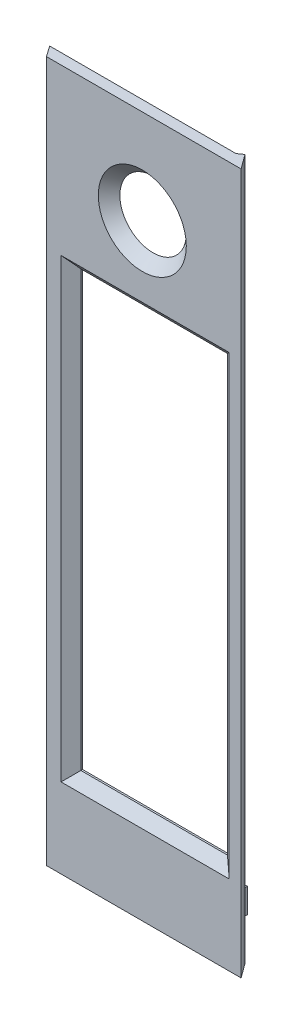
ISO-10303-21;
HEADER;
FILE_DESCRIPTION(('STEP AP214'),'2;1');
FILE_NAME('part.step','',(''),(''),'','','');
FILE_SCHEMA(('AUTOMOTIVE_DESIGN { 1 0 10303 214 1 1 1 1 }'));
ENDSEC;
DATA;
#1=APPLICATION_CONTEXT('core data for automotive mechanical design processes');
#2=APPLICATION_PROTOCOL_DEFINITION('international standard','automotive_design',2000,#1);
#3=PRODUCT_CONTEXT('',#1,'mechanical');
#4=PRODUCT('Part','Part','',(#3));
#5=PRODUCT_RELATED_PRODUCT_CATEGORY('part','',(#4));
#6=PRODUCT_DEFINITION_FORMATION('','',#4);
#7=PRODUCT_DEFINITION_CONTEXT('part definition',#1,'design');
#8=PRODUCT_DEFINITION('design','',#6,#7);
#9=PRODUCT_DEFINITION_SHAPE('','',#8);
#10=(LENGTH_UNIT() NAMED_UNIT(*) SI_UNIT(.MILLI.,.METRE.));
#11=(NAMED_UNIT(*) PLANE_ANGLE_UNIT() SI_UNIT($,.RADIAN.));
#12=(NAMED_UNIT(*) SI_UNIT($,.STERADIAN.) SOLID_ANGLE_UNIT());
#13=UNCERTAINTY_MEASURE_WITH_UNIT(LENGTH_MEASURE(1.E-05),#10,'distance_accuracy_value','');
#14=(GEOMETRIC_REPRESENTATION_CONTEXT(3) GLOBAL_UNCERTAINTY_ASSIGNED_CONTEXT((#13)) GLOBAL_UNIT_ASSIGNED_CONTEXT((#10,
#11,#12)) REPRESENTATION_CONTEXT('',''));
#15=CARTESIAN_POINT('',(0.,0.,0.));
#16=DIRECTION('',(0.,0.,1.));
#17=DIRECTION('',(1.,0.,0.));
#18=AXIS2_PLACEMENT_3D('',#15,#16,#17);
#19=CARTESIAN_POINT('',(0.,0.,0.));
#20=DIRECTION('',(0.,0.,1.));
#21=DIRECTION('',(1.,0.,0.));
#22=AXIS2_PLACEMENT_3D('',#19,#20,#21);
#23=PLANE('',#22);
#24=DIRECTION('',(0.,1.,0.));
#25=VECTOR('',#24,1.);
#26=CARTESIAN_POINT('',(-28.8258205594295,28.31847753789,0.));
#27=LINE('',#26,#25);
#28=CARTESIAN_POINT('',(-28.8258205594295,28.31847753789,0.));
#29=VERTEX_POINT('',#28);
#30=CARTESIAN_POINT('',(-28.8258205594295,29.06,0.));
#31=VERTEX_POINT('',#30);
#32=EDGE_CURVE('E348',#29,#31,#27,.T.);
#33=ORIENTED_EDGE('',*,*,#32,.F.);
#34=DIRECTION('',(-0.707106781186547,0.707106781186548,0.));
#35=VECTOR('',#34,1.);
#36=CARTESIAN_POINT('',(-25.4772649871259,24.9699219655863,0.));
#37=LINE('',#36,#35);
#38=CARTESIAN_POINT('',(-25.4772649871259,24.9699219655863,0.));
#39=VERTEX_POINT('',#38);
#40=EDGE_CURVE('E332',#39,#29,#37,.T.);
#41=ORIENTED_EDGE('',*,*,#40,.F.);
#42=DIRECTION('',(-1.,0.,0.));
#43=VECTOR('',#42,1.);
#44=CARTESIAN_POINT('',(-24.3676581572758,24.9699219655863,0.));
#45=LINE('',#44,#43);
#46=CARTESIAN_POINT('',(-24.3676581572758,24.9699219655863,0.));
#47=VERTEX_POINT('',#46);
#48=EDGE_CURVE('E335',#47,#39,#45,.T.);
#49=ORIENTED_EDGE('',*,*,#48,.F.);
#50=DIRECTION('',(0.,-1.,0.));
#51=VECTOR('',#50,1.);
#52=CARTESIAN_POINT('',(-24.3676581572758,27.0360334536606,0.));
#53=LINE('',#52,#51);
#54=CARTESIAN_POINT('',(-24.3676581572758,27.0360334536606,0.));
#55=VERTEX_POINT('',#54);
#56=EDGE_CURVE('E339',#55,#47,#53,.T.);
#57=ORIENTED_EDGE('',*,*,#56,.F.);
#58=DIRECTION('',(0.707106781186547,-0.707106781186548,0.));
#59=VECTOR('',#58,1.);
#60=CARTESIAN_POINT('',(-26.3916247036152,29.06,0.));
#61=LINE('',#60,#59);
#62=CARTESIAN_POINT('',(-26.3916247036152,29.06,0.));
#63=VERTEX_POINT('',#62);
#64=EDGE_CURVE('E342',#63,#55,#61,.T.);
#65=ORIENTED_EDGE('',*,*,#64,.F.);
#66=DIRECTION('',(1.,0.,0.));
#67=VECTOR('',#66,1.);
#68=CARTESIAN_POINT('',(-28.8258205594295,29.06,0.));
#69=LINE('',#68,#67);
#70=EDGE_CURVE('E345',#31,#63,#69,.T.);
#71=ORIENTED_EDGE('',*,*,#70,.F.);
#72=EDGE_LOOP('',(#33,#41,#49,#57,#65,#71));
#73=FACE_BOUND('',#72,.T.);
#74=DIRECTION('',(0.,-1.,0.));
#75=VECTOR('',#74,1.);
#76=CARTESIAN_POINT('',(-36.7042825394933,16.2,0.));
#77=LINE('',#76,#75);
#78=CARTESIAN_POINT('',(-36.7042825394933,16.2,0.));
#79=VERTEX_POINT('',#78);
#80=CARTESIAN_POINT('',(-36.7042825394933,-24.1,0.));
#81=VERTEX_POINT('',#80);
#82=EDGE_CURVE('E411',#79,#81,#77,.T.);
#83=ORIENTED_EDGE('',*,*,#82,.T.);
#84=DIRECTION('',(1.,0.,0.));
#85=VECTOR('',#84,1.);
#86=CARTESIAN_POINT('',(-36.7042825394933,-24.1,0.));
#87=LINE('',#86,#85);
#88=CARTESIAN_POINT('',(-23.1042825394933,-24.1,0.));
#89=VERTEX_POINT('',#88);
#90=EDGE_CURVE('E414',#81,#89,#87,.T.);
#91=ORIENTED_EDGE('',*,*,#90,.T.);
#92=DIRECTION('',(0.,1.,0.));
#93=VECTOR('',#92,1.);
#94=CARTESIAN_POINT('',(-23.1042825394933,16.2,0.));
#95=LINE('',#94,#93);
#96=CARTESIAN_POINT('',(-23.1042825394933,16.2,0.));
#97=VERTEX_POINT('',#96);
#98=EDGE_CURVE('E417',#89,#97,#95,.T.);
#99=ORIENTED_EDGE('',*,*,#98,.T.);
#100=DIRECTION('',(-1.,0.,0.));
#101=VECTOR('',#100,1.);
#102=CARTESIAN_POINT('',(-36.7042825394933,16.2,0.));
#103=LINE('',#102,#101);
#104=EDGE_CURVE('E420',#97,#79,#103,.T.);
#105=ORIENTED_EDGE('',*,*,#104,.T.);
#106=EDGE_LOOP('',(#83,#91,#99,#105));
#107=FACE_BOUND('',#106,.T.);
#108=DIRECTION('',(-1.,0.,0.));
#109=VECTOR('',#108,1.);
#110=CARTESIAN_POINT('',(-39.7589822132106,32.5,0.));
#111=LINE('',#110,#109);
#112=CARTESIAN_POINT('',(-22.4809540872309,32.5,0.));
#113=VERTEX_POINT('',#112);
#114=CARTESIAN_POINT('',(-39.7589822132106,32.5,0.));
#115=VERTEX_POINT('',#114);
#116=EDGE_CURVE('E438',#113,#115,#111,.T.);
#117=ORIENTED_EDGE('',*,*,#116,.F.);
#118=DIRECTION('',(0.,-1.,0.));
#119=VECTOR('',#118,1.);
#120=CARTESIAN_POINT('',(-22.4809540872309,33.3196787347788,0.));
#121=LINE('',#120,#119);
#122=CARTESIAN_POINT('',(-22.4809540872309,-32.5,0.));
#123=VERTEX_POINT('',#122);
#124=EDGE_CURVE('E242',#113,#123,#121,.T.);
#125=ORIENTED_EDGE('',*,*,#124,.T.);
#126=DIRECTION('',(1.,0.,0.));
#127=VECTOR('',#126,1.);
#128=CARTESIAN_POINT('',(-39.7589822132106,-32.5,0.));
#129=LINE('',#128,#127);
#130=CARTESIAN_POINT('',(-39.7589822132106,-32.5,0.));
#131=VERTEX_POINT('',#130);
#132=EDGE_CURVE('E253',#131,#123,#129,.T.);
#133=ORIENTED_EDGE('',*,*,#132,.F.);
#134=DIRECTION('',(0.,-1.,0.));
#135=VECTOR('',#134,1.);
#136=CARTESIAN_POINT('',(-39.7589822132106,32.5,0.));
#137=LINE('',#136,#135);
#138=EDGE_CURVE('E434',#115,#131,#137,.T.);
#139=ORIENTED_EDGE('',*,*,#138,.F.);
#140=EDGE_LOOP('',(#117,#125,#133,#139));
#141=FACE_BOUND('',#140,.T.);
#142=CARTESIAN_POINT('',(-30.1676581572758,23.76,0.));
#143=DIRECTION('',(0.,0.,1.));
#144=DIRECTION('',(1.,0.,0.));
#145=AXIS2_PLACEMENT_3D('',#142,#143,#144);
#146=CIRCLE('',#145,3.08202397854911);
#147=CARTESIAN_POINT('',(-27.0856341787267,23.76,0.));
#148=VERTEX_POINT('',#147);
#149=EDGE_CURVE('E431',#148,#148,#146,.T.);
#150=ORIENTED_EDGE('',*,*,#149,.T.);
#151=EDGE_LOOP('',(#150));
#152=FACE_BOUND('',#151,.T.);
#153=DIRECTION('',(-1.,0.,0.));
#154=VECTOR('',#153,1.);
#155=CARTESIAN_POINT('',(-35.2676581572757,24.6975935006714,0.));
#156=LINE('',#155,#154);
#157=CARTESIAN_POINT('',(-35.2676581572757,24.6975935006714,0.));
#158=VERTEX_POINT('',#157);
#159=CARTESIAN_POINT('',(-36.2676581572757,24.6975935006714,0.));
#160=VERTEX_POINT('',#159);
#161=EDGE_CURVE('E351',#158,#160,#156,.T.);
#162=ORIENTED_EDGE('',*,*,#161,.F.);
#163=DIRECTION('',(-0.732988751760297,-0.680240758697156,0.));
#164=VECTOR('',#163,1.);
#165=CARTESIAN_POINT('',(-31.365999462503,28.31847753789,0.));
#166=LINE('',#165,#164);
#167=CARTESIAN_POINT('',(-31.365999462503,28.31847753789,0.));
#168=VERTEX_POINT('',#167);
#169=EDGE_CURVE('E367',#168,#158,#166,.T.);
#170=ORIENTED_EDGE('',*,*,#169,.F.);
#171=DIRECTION('',(0.,-1.,0.));
#172=VECTOR('',#171,1.);
#173=CARTESIAN_POINT('',(-31.365999462503,29.06,0.));
#174=LINE('',#173,#172);
#175=CARTESIAN_POINT('',(-31.365999462503,29.06,0.));
#176=VERTEX_POINT('',#175);
#177=EDGE_CURVE('E389',#176,#168,#174,.T.);
#178=ORIENTED_EDGE('',*,*,#177,.F.);
#179=DIRECTION('',(1.,0.,0.));
#180=VECTOR('',#179,1.);
#181=CARTESIAN_POINT('',(-34.9292866780418,29.06,0.));
#182=LINE('',#181,#180);
#183=CARTESIAN_POINT('',(-34.9292866780418,29.06,0.));
#184=VERTEX_POINT('',#183);
#185=EDGE_CURVE('E386',#184,#176,#182,.T.);
#186=ORIENTED_EDGE('',*,*,#185,.F.);
#187=DIRECTION('',(0.707106781186548,0.707106781186547,0.));
#188=VECTOR('',#187,1.);
#189=CARTESIAN_POINT('',(-36.2676581572757,27.721628520766,0.));
#190=LINE('',#189,#188);
#191=CARTESIAN_POINT('',(-36.2676581572757,27.721628520766,0.));
#192=VERTEX_POINT('',#191);
#193=EDGE_CURVE('E383',#192,#184,#190,.T.);
#194=ORIENTED_EDGE('',*,*,#193,.F.);
#195=DIRECTION('',(0.,1.,0.));
#196=VECTOR('',#195,1.);
#197=CARTESIAN_POINT('',(-36.2676581572757,24.6975935006714,0.));
#198=LINE('',#197,#196);
#199=EDGE_CURVE('E380',#160,#192,#198,.T.);
#200=ORIENTED_EDGE('',*,*,#199,.F.);
#201=EDGE_LOOP('',(#162,#170,#178,#186,#194,#200));
#202=FACE_BOUND('',#201,.T.);
#203=DIRECTION('',(0.,1.,0.));
#204=VECTOR('',#203,1.);
#205=CARTESIAN_POINT('',(-34.5712530855965,-29.9150808401263,0.));
#206=LINE('',#205,#204);
#207=CARTESIAN_POINT('',(-34.5712530855965,-29.9150808401263,0.));
#208=VERTEX_POINT('',#207);
#209=CARTESIAN_POINT('',(-34.5712530855965,-27.6351784781281,0.));
#210=VERTEX_POINT('',#209);
#211=EDGE_CURVE('E303',#208,#210,#206,.T.);
#212=ORIENTED_EDGE('',*,*,#211,.F.);
#213=DIRECTION('',(-1.,0.,0.));
#214=VECTOR('',#213,1.);
#215=CARTESIAN_POINT('',(-34.5712530855965,-29.9150808401263,0.));
#216=LINE('',#215,#214);
#217=CARTESIAN_POINT('',(-23.2046020400958,-29.9150808401263,0.));
#218=VERTEX_POINT('',#217);
#219=EDGE_CURVE('E293',#218,#208,#216,.T.);
#220=ORIENTED_EDGE('',*,*,#219,.F.);
#221=DIRECTION('',(0.,-1.,0.));
#222=VECTOR('',#221,1.);
#223=CARTESIAN_POINT('',(-23.2046020400958,-29.9150808401263,0.));
#224=LINE('',#223,#222);
#225=CARTESIAN_POINT('',(-23.2046020400958,-27.6351784781281,0.));
#226=VERTEX_POINT('',#225);
#227=EDGE_CURVE('E296',#226,#218,#224,.T.);
#228=ORIENTED_EDGE('',*,*,#227,.F.);
#229=DIRECTION('',(1.,0.,0.));
#230=VECTOR('',#229,1.);
#231=CARTESIAN_POINT('',(-34.5712530855965,-27.6351784781281,0.));
#232=LINE('',#231,#230);
#233=EDGE_CURVE('E300',#210,#226,#232,.T.);
#234=ORIENTED_EDGE('',*,*,#233,.F.);
#235=EDGE_LOOP('',(#212,#220,#228,#234));
#236=FACE_BOUND('',#235,.T.);
#237=ADVANCED_FACE('F43',(#73,#107,#141,#152,#202,#236),#23,.F.);
#238=CARTESIAN_POINT('',(0.,0.,1.));
#239=DIRECTION('',(0.,0.,1.));
#240=DIRECTION('',(1.,0.,0.));
#241=AXIS2_PLACEMENT_3D('',#238,#239,#240);
#242=PLANE('',#241);
#243=DIRECTION('',(0.,1.,0.));
#244=VECTOR('',#243,1.);
#245=CARTESIAN_POINT('',(-37.7042825394934,0.,1.));
#246=LINE('',#245,#244);
#247=CARTESIAN_POINT('',(-37.7042825394933,-25.1,1.));
#248=VERTEX_POINT('',#247);
#249=CARTESIAN_POINT('',(-37.7042825394934,17.2,1.));
#250=VERTEX_POINT('',#249);
#251=EDGE_CURVE('E454',#248,#250,#246,.T.);
#252=ORIENTED_EDGE('',*,*,#251,.T.);
#253=DIRECTION('',(1.,0.,0.));
#254=VECTOR('',#253,1.);
#255=CARTESIAN_POINT('',(0.,17.2,1.));
#256=LINE('',#255,#254);
#257=CARTESIAN_POINT('',(-22.1042825394933,17.2,1.));
#258=VERTEX_POINT('',#257);
#259=EDGE_CURVE('E456',#250,#258,#256,.T.);
#260=ORIENTED_EDGE('',*,*,#259,.T.);
#261=DIRECTION('',(0.,-1.,0.));
#262=VECTOR('',#261,1.);
#263=CARTESIAN_POINT('',(-22.1042825394933,0.,1.));
#264=LINE('',#263,#262);
#265=CARTESIAN_POINT('',(-22.1042825394933,-25.1,1.));
#266=VERTEX_POINT('',#265);
#267=EDGE_CURVE('E452',#258,#266,#264,.T.);
#268=ORIENTED_EDGE('',*,*,#267,.T.);
#269=DIRECTION('',(-1.,0.,0.));
#270=VECTOR('',#269,1.);
#271=CARTESIAN_POINT('',(0.,-25.1,1.));
#272=LINE('',#271,#270);
#273=EDGE_CURVE('E450',#266,#248,#272,.T.);
#274=ORIENTED_EDGE('',*,*,#273,.T.);
#275=EDGE_LOOP('',(#252,#260,#268,#274));
#276=FACE_BOUND('',#275,.T.);
#277=CARTESIAN_POINT('',(-30.1676581572758,23.76,1.));
#278=DIRECTION('',(0.,0.,1.));
#279=DIRECTION('',(1.,0.,0.));
#280=AXIS2_PLACEMENT_3D('',#277,#278,#279);
#281=CIRCLE('',#280,4.08202397854913);
#282=CARTESIAN_POINT('',(-26.0856341787266,23.76,1.));
#283=VERTEX_POINT('',#282);
#284=EDGE_CURVE('E441',#283,#283,#281,.F.);
#285=ORIENTED_EDGE('',*,*,#284,.T.);
#286=EDGE_LOOP('',(#285));
#287=FACE_BOUND('',#286,.T.);
#288=DIRECTION('',(0.,-1.,0.));
#289=VECTOR('',#288,1.);
#290=CARTESIAN_POINT('',(-39.0587746750009,33.7207745887615,1.));
#291=LINE('',#290,#289);
#292=CARTESIAN_POINT('',(-39.0587746750009,32.5,1.));
#293=VERTEX_POINT('',#292);
#294=CARTESIAN_POINT('',(-39.0587746750009,-32.5,1.));
#295=VERTEX_POINT('',#294);
#296=EDGE_CURVE('E266',#293,#295,#291,.T.);
#297=ORIENTED_EDGE('',*,*,#296,.T.);
#298=DIRECTION('',(1.,0.,0.));
#299=VECTOR('',#298,1.);
#300=CARTESIAN_POINT('',(-39.7589822132106,-32.5,1.));
#301=LINE('',#300,#299);
#302=CARTESIAN_POINT('',(-20.9972089481425,-32.5,1.));
#303=VERTEX_POINT('',#302);
#304=EDGE_CURVE('E435',#295,#303,#301,.T.);
#305=ORIENTED_EDGE('',*,*,#304,.T.);
#306=DIRECTION('',(0.,-1.,0.));
#307=VECTOR('',#306,1.);
#308=CARTESIAN_POINT('',(-20.9972089481425,34.2892734944017,1.));
#309=LINE('',#308,#307);
#310=CARTESIAN_POINT('',(-20.9972089481425,32.5,1.));
#311=VERTEX_POINT('',#310);
#312=EDGE_CURVE('E276',#311,#303,#309,.T.);
#313=ORIENTED_EDGE('',*,*,#312,.F.);
#314=DIRECTION('',(-1.,0.,0.));
#315=VECTOR('',#314,1.);
#316=CARTESIAN_POINT('',(-39.7589822132106,32.5,1.));
#317=LINE('',#316,#315);
#318=EDGE_CURVE('E437',#311,#293,#317,.T.);
#319=ORIENTED_EDGE('',*,*,#318,.T.);
#320=EDGE_LOOP('',(#297,#305,#313,#319));
#321=FACE_BOUND('',#320,.T.);
#322=ADVANCED_FACE('F479',(#276,#287,#321),#242,.T.);
#323=CARTESIAN_POINT('',(-39.7589822132106,-32.5,1.));
#324=DIRECTION('',(0.,1.,0.));
#325=DIRECTION('',(0.,0.,1.));
#326=AXIS2_PLACEMENT_3D('',#323,#324,#325);
#327=PLANE('',#326);
#328=ORIENTED_EDGE('',*,*,#304,.F.);
#329=DIRECTION('',(0.573576436351048,0.,0.81915204428899));
#330=VECTOR('',#329,1.);
#331=CARTESIAN_POINT('',(-39.7589822132106,-32.5,0.));
#332=LINE('',#331,#330);
#333=EDGE_CURVE('E264',#131,#295,#332,.T.);
#334=ORIENTED_EDGE('',*,*,#333,.F.);
#335=ORIENTED_EDGE('',*,*,#132,.T.);
#336=DIRECTION('',(0.81915204428899,0.,-0.573576436351048));
#337=VECTOR('',#336,1.);
#338=CARTESIAN_POINT('',(-21.9831501211763,-32.5,-0.348566089582081));
#339=LINE('',#338,#337);
#340=CARTESIAN_POINT('',(-21.9831501211763,-32.5,-0.348566089582081));
#341=VERTEX_POINT('',#340);
#342=EDGE_CURVE('E235',#123,#341,#339,.T.);
#343=ORIENTED_EDGE('',*,*,#342,.T.);
#344=DIRECTION('',(0.573576436351046,0.,0.819152044288992));
#345=VECTOR('',#344,1.);
#346=CARTESIAN_POINT('',(-21.7390815176867,-32.5,0.));
#347=LINE('',#346,#345);
#348=CARTESIAN_POINT('',(-21.7390815176867,-32.5,0.));
#349=VERTEX_POINT('',#348);
#350=EDGE_CURVE('E250',#341,#349,#347,.T.);
#351=ORIENTED_EDGE('',*,*,#350,.T.);
#352=DIRECTION('',(0.595814334887512,0.,0.803122206356263));
#353=VECTOR('',#352,1.);
#354=CARTESIAN_POINT('',(-20.9972089481425,-32.5,1.));
#355=LINE('',#354,#353);
#356=EDGE_CURVE('E272',#349,#303,#355,.T.);
#357=ORIENTED_EDGE('',*,*,#356,.T.);
#358=EDGE_LOOP('',(#328,#334,#335,#343,#351,#357));
#359=FACE_BOUND('',#358,.T.);
#360=ADVANCED_FACE('F248',(#359),#327,.F.);
#361=CARTESIAN_POINT('',(-39.7589822132106,32.5,1.));
#362=DIRECTION('',(0.,-1.,0.));
#363=DIRECTION('',(0.,0.,-1.));
#364=AXIS2_PLACEMENT_3D('',#361,#362,#363);
#365=PLANE('',#364);
#366=DIRECTION('',(-0.595814334887512,0.,-0.803122206356263));
#367=VECTOR('',#366,1.);
#368=CARTESIAN_POINT('',(-20.9972089481425,32.5,1.));
#369=LINE('',#368,#367);
#370=CARTESIAN_POINT('',(-21.7390815176867,32.5,0.));
#371=VERTEX_POINT('',#370);
#372=EDGE_CURVE('E273',#311,#371,#369,.T.);
#373=ORIENTED_EDGE('',*,*,#372,.T.);
#374=DIRECTION('',(-0.573576436351046,0.,-0.819152044288992));
#375=VECTOR('',#374,1.);
#376=CARTESIAN_POINT('',(-21.7390815176867,32.5,0.));
#377=LINE('',#376,#375);
#378=CARTESIAN_POINT('',(-21.9831501211763,32.5,-0.348566089582081));
#379=VERTEX_POINT('',#378);
#380=EDGE_CURVE('E241',#371,#379,#377,.T.);
#381=ORIENTED_EDGE('',*,*,#380,.T.);
#382=DIRECTION('',(-0.81915204428899,0.,0.573576436351048));
#383=VECTOR('',#382,1.);
#384=CARTESIAN_POINT('',(-21.9831501211763,32.5,-0.348566089582081));
#385=LINE('',#384,#383);
#386=EDGE_CURVE('E237',#379,#113,#385,.T.);
#387=ORIENTED_EDGE('',*,*,#386,.T.);
#388=ORIENTED_EDGE('',*,*,#116,.T.);
#389=DIRECTION('',(-0.573576436351049,0.,-0.81915204428899));
#390=VECTOR('',#389,1.);
#391=CARTESIAN_POINT('',(-39.7589822132106,32.5,0.));
#392=LINE('',#391,#390);
#393=EDGE_CURVE('E269',#293,#115,#392,.T.);
#394=ORIENTED_EDGE('',*,*,#393,.F.);
#395=ORIENTED_EDGE('',*,*,#318,.F.);
#396=EDGE_LOOP('',(#373,#381,#387,#388,#394,#395));
#397=FACE_BOUND('',#396,.T.);
#398=ADVANCED_FACE('F507',(#397),#365,.F.);
#399=CARTESIAN_POINT('',(-36.7042825394933,16.2,1.));
#400=DIRECTION('',(1.,0.,0.));
#401=DIRECTION('',(0.,1.,0.));
#402=AXIS2_PLACEMENT_3D('',#399,#400,#401);
#403=PLANE('',#402);
#404=DIRECTION('',(0.,0.,-1.));
#405=VECTOR('',#404,1.);
#406=CARTESIAN_POINT('',(-36.7042825394933,16.2,1.));
#407=LINE('',#406,#405);
#408=CARTESIAN_POINT('',(-36.7042825394933,16.2,0.160900368822706));
#409=VERTEX_POINT('',#408);
#410=EDGE_CURVE('E423',#409,#79,#407,.T.);
#411=ORIENTED_EDGE('',*,*,#410,.F.);
#412=DIRECTION('',(0.,-1.,0.));
#413=VECTOR('',#412,1.);
#414=CARTESIAN_POINT('',(-36.7042825394933,16.2,0.160900368822706));
#415=LINE('',#414,#413);
#416=CARTESIAN_POINT('',(-36.7042825394933,-24.1,0.160900368822706));
#417=VERTEX_POINT('',#416);
#418=EDGE_CURVE('E67',#409,#417,#415,.T.);
#419=ORIENTED_EDGE('',*,*,#418,.T.);
#420=DIRECTION('',(0.,0.,-1.));
#421=VECTOR('',#420,1.);
#422=CARTESIAN_POINT('',(-36.7042825394933,-24.1,1.));
#423=LINE('',#422,#421);
#424=EDGE_CURVE('E429',#417,#81,#423,.T.);
#425=ORIENTED_EDGE('',*,*,#424,.T.);
#426=ORIENTED_EDGE('',*,*,#82,.F.);
#427=EDGE_LOOP('',(#411,#419,#425,#426));
#428=FACE_BOUND('',#427,.T.);
#429=ADVANCED_FACE('F492',(#428),#403,.T.);
#430=CARTESIAN_POINT('',(-36.7042825394933,-24.1,1.));
#431=DIRECTION('',(0.,1.,0.));
#432=DIRECTION('',(0.,0.,1.));
#433=AXIS2_PLACEMENT_3D('',#430,#431,#432);
#434=PLANE('',#433);
#435=ORIENTED_EDGE('',*,*,#424,.F.);
#436=DIRECTION('',(1.,0.,0.));
#437=VECTOR('',#436,1.);
#438=CARTESIAN_POINT('',(-36.7042825394933,-24.1,0.160900368822706));
#439=LINE('',#438,#437);
#440=CARTESIAN_POINT('',(-23.1042825394933,-24.1,0.160900368822706));
#441=VERTEX_POINT('',#440);
#442=EDGE_CURVE('E11',#417,#441,#439,.T.);
#443=ORIENTED_EDGE('',*,*,#442,.T.);
#444=DIRECTION('',(0.,0.,-1.));
#445=VECTOR('',#444,1.);
#446=CARTESIAN_POINT('',(-23.1042825394933,-24.1,1.));
#447=LINE('',#446,#445);
#448=EDGE_CURVE('E427',#441,#89,#447,.T.);
#449=ORIENTED_EDGE('',*,*,#448,.T.);
#450=ORIENTED_EDGE('',*,*,#90,.F.);
#451=EDGE_LOOP('',(#435,#443,#449,#450));
#452=FACE_BOUND('',#451,.T.);
#453=ADVANCED_FACE('F499',(#452),#434,.T.);
#454=CARTESIAN_POINT('',(-23.1042825394933,16.2,1.));
#455=DIRECTION('',(-1.,0.,0.));
#456=DIRECTION('',(0.,-1.,0.));
#457=AXIS2_PLACEMENT_3D('',#454,#455,#456);
#458=PLANE('',#457);
#459=ORIENTED_EDGE('',*,*,#448,.F.);
#460=DIRECTION('',(0.,1.,0.));
#461=VECTOR('',#460,1.);
#462=CARTESIAN_POINT('',(-23.1042825394933,16.2,0.160900368822706));
#463=LINE('',#462,#461);
#464=CARTESIAN_POINT('',(-23.1042825394933,16.2,0.160900368822706));
#465=VERTEX_POINT('',#464);
#466=EDGE_CURVE('E53',#441,#465,#463,.T.);
#467=ORIENTED_EDGE('',*,*,#466,.T.);
#468=DIRECTION('',(0.,0.,-1.));
#469=VECTOR('',#468,1.);
#470=CARTESIAN_POINT('',(-23.1042825394933,16.2,1.));
#471=LINE('',#470,#469);
#472=EDGE_CURVE('E425',#465,#97,#471,.T.);
#473=ORIENTED_EDGE('',*,*,#472,.T.);
#474=ORIENTED_EDGE('',*,*,#98,.F.);
#475=EDGE_LOOP('',(#459,#467,#473,#474));
#476=FACE_BOUND('',#475,.T.);
#477=ADVANCED_FACE('F498',(#476),#458,.T.);
#478=CARTESIAN_POINT('',(-36.7042825394933,16.2,1.));
#479=DIRECTION('',(0.,-1.,0.));
#480=DIRECTION('',(0.,0.,-1.));
#481=AXIS2_PLACEMENT_3D('',#478,#479,#480);
#482=PLANE('',#481);
#483=ORIENTED_EDGE('',*,*,#472,.F.);
#484=DIRECTION('',(-1.,0.,0.));
#485=VECTOR('',#484,1.);
#486=CARTESIAN_POINT('',(-36.7042825394933,16.2,0.160900368822706));
#487=LINE('',#486,#485);
#488=EDGE_CURVE('E447',#465,#409,#487,.T.);
#489=ORIENTED_EDGE('',*,*,#488,.T.);
#490=ORIENTED_EDGE('',*,*,#410,.T.);
#491=ORIENTED_EDGE('',*,*,#104,.F.);
#492=EDGE_LOOP('',(#483,#489,#490,#491));
#493=FACE_BOUND('',#492,.T.);
#494=ADVANCED_FACE('F489',(#493),#482,.T.);
#495=CARTESIAN_POINT('',(-35.2676581572757,24.6975935006714,-1.8));
#496=DIRECTION('',(0.,1.,0.));
#497=DIRECTION('',(0.,0.,1.));
#498=AXIS2_PLACEMENT_3D('',#495,#496,#497);
#499=PLANE('',#498);
#500=ORIENTED_EDGE('',*,*,#161,.T.);
#501=DIRECTION('',(0.,0.,1.));
#502=VECTOR('',#501,1.);
#503=CARTESIAN_POINT('',(-36.2676581572757,24.6975935006714,-1.8));
#504=LINE('',#503,#502);
#505=CARTESIAN_POINT('',(-36.2676581572757,24.6975935006714,-1.8));
#506=VERTEX_POINT('',#505);
#507=EDGE_CURVE('E408',#506,#160,#504,.T.);
#508=ORIENTED_EDGE('',*,*,#507,.F.);
#509=DIRECTION('',(-1.,0.,0.));
#510=VECTOR('',#509,1.);
#511=CARTESIAN_POINT('',(-35.2676581572757,24.6975935006714,-1.8));
#512=LINE('',#511,#510);
#513=CARTESIAN_POINT('',(-35.2676581572757,24.6975935006714,-1.8));
#514=VERTEX_POINT('',#513);
#515=EDGE_CURVE('E363',#514,#506,#512,.T.);
#516=ORIENTED_EDGE('',*,*,#515,.F.);
#517=DIRECTION('',(0.,0.,1.));
#518=VECTOR('',#517,1.);
#519=CARTESIAN_POINT('',(-35.2676581572757,24.6975935006714,-1.8));
#520=LINE('',#519,#518);
#521=EDGE_CURVE('E377',#514,#158,#520,.T.);
#522=ORIENTED_EDGE('',*,*,#521,.T.);
#523=EDGE_LOOP('',(#500,#508,#516,#522));
#524=FACE_BOUND('',#523,.T.);
#525=ADVANCED_FACE('F555',(#524),#499,.F.);
#526=CARTESIAN_POINT('',(-36.2676581572757,24.6975935006714,-1.8));
#527=DIRECTION('',(1.,0.,0.));
#528=DIRECTION('',(0.,0.,-1.));
#529=AXIS2_PLACEMENT_3D('',#526,#527,#528);
#530=PLANE('',#529);
#531=ORIENTED_EDGE('',*,*,#199,.T.);
#532=DIRECTION('',(0.,0.,1.));
#533=VECTOR('',#532,1.);
#534=CARTESIAN_POINT('',(-36.2676581572757,27.721628520766,-1.8));
#535=LINE('',#534,#533);
#536=CARTESIAN_POINT('',(-36.2676581572757,27.721628520766,-1.8));
#537=VERTEX_POINT('',#536);
#538=EDGE_CURVE('E405',#537,#192,#535,.T.);
#539=ORIENTED_EDGE('',*,*,#538,.F.);
#540=DIRECTION('',(0.,1.,0.));
#541=VECTOR('',#540,1.);
#542=CARTESIAN_POINT('',(-36.2676581572757,24.6975935006714,-1.8));
#543=LINE('',#542,#541);
#544=EDGE_CURVE('E366',#506,#537,#543,.T.);
#545=ORIENTED_EDGE('',*,*,#544,.F.);
#546=ORIENTED_EDGE('',*,*,#507,.T.);
#547=EDGE_LOOP('',(#531,#539,#545,#546));
#548=FACE_BOUND('',#547,.T.);
#549=ADVANCED_FACE('F779',(#548),#530,.F.);
#550=CARTESIAN_POINT('',(-36.2676581572757,27.721628520766,-1.8));
#551=DIRECTION('',(0.707106781186547,-0.707106781186548,0.));
#552=DIRECTION('',(0.707106781186548,0.707106781186547,0.));
#553=AXIS2_PLACEMENT_3D('',#550,#551,#552);
#554=PLANE('',#553);
#555=ORIENTED_EDGE('',*,*,#193,.T.);
#556=DIRECTION('',(0.,0.,1.));
#557=VECTOR('',#556,1.);
#558=CARTESIAN_POINT('',(-34.9292866780418,29.06,-1.8));
#559=LINE('',#558,#557);
#560=CARTESIAN_POINT('',(-34.9292866780418,29.06,-1.8));
#561=VERTEX_POINT('',#560);
#562=EDGE_CURVE('E402',#561,#184,#559,.T.);
#563=ORIENTED_EDGE('',*,*,#562,.F.);
#564=DIRECTION('',(0.707106781186548,0.707106781186547,0.));
#565=VECTOR('',#564,1.);
#566=CARTESIAN_POINT('',(-36.2676581572757,27.721628520766,-1.8));
#567=LINE('',#566,#565);
#568=EDGE_CURVE('E369',#537,#561,#567,.T.);
#569=ORIENTED_EDGE('',*,*,#568,.F.);
#570=ORIENTED_EDGE('',*,*,#538,.T.);
#571=EDGE_LOOP('',(#555,#563,#569,#570));
#572=FACE_BOUND('',#571,.T.);
#573=ADVANCED_FACE('F769',(#572),#554,.F.);
#574=CARTESIAN_POINT('',(-34.9292866780418,29.06,-1.8));
#575=DIRECTION('',(0.,-1.,0.));
#576=DIRECTION('',(0.,0.,-1.));
#577=AXIS2_PLACEMENT_3D('',#574,#575,#576);
#578=PLANE('',#577);
#579=ORIENTED_EDGE('',*,*,#185,.T.);
#580=DIRECTION('',(0.,0.,1.));
#581=VECTOR('',#580,1.);
#582=CARTESIAN_POINT('',(-31.365999462503,29.06,-1.8));
#583=LINE('',#582,#581);
#584=CARTESIAN_POINT('',(-31.365999462503,29.06,-1.8));
#585=VERTEX_POINT('',#584);
#586=EDGE_CURVE('E399',#585,#176,#583,.T.);
#587=ORIENTED_EDGE('',*,*,#586,.F.);
#588=DIRECTION('',(1.,0.,0.));
#589=VECTOR('',#588,1.);
#590=CARTESIAN_POINT('',(-34.9292866780418,29.06,-1.8));
#591=LINE('',#590,#589);
#592=EDGE_CURVE('E371',#561,#585,#591,.T.);
#593=ORIENTED_EDGE('',*,*,#592,.F.);
#594=ORIENTED_EDGE('',*,*,#562,.T.);
#595=EDGE_LOOP('',(#579,#587,#593,#594));
#596=FACE_BOUND('',#595,.T.);
#597=ADVANCED_FACE('F759',(#596),#578,.F.);
#598=CARTESIAN_POINT('',(-31.365999462503,29.06,-1.8));
#599=DIRECTION('',(-1.,0.,0.));
#600=DIRECTION('',(0.,0.,1.));
#601=AXIS2_PLACEMENT_3D('',#598,#599,#600);
#602=PLANE('',#601);
#603=ORIENTED_EDGE('',*,*,#177,.T.);
#604=DIRECTION('',(0.,0.,1.));
#605=VECTOR('',#604,1.);
#606=CARTESIAN_POINT('',(-31.365999462503,28.31847753789,-1.8));
#607=LINE('',#606,#605);
#608=CARTESIAN_POINT('',(-31.365999462503,28.31847753789,-1.8));
#609=VERTEX_POINT('',#608);
#610=EDGE_CURVE('E396',#609,#168,#607,.T.);
#611=ORIENTED_EDGE('',*,*,#610,.F.);
#612=DIRECTION('',(0.,-1.,0.));
#613=VECTOR('',#612,1.);
#614=CARTESIAN_POINT('',(-31.365999462503,29.06,-1.8));
#615=LINE('',#614,#613);
#616=EDGE_CURVE('E373',#585,#609,#615,.T.);
#617=ORIENTED_EDGE('',*,*,#616,.F.);
#618=ORIENTED_EDGE('',*,*,#586,.T.);
#619=EDGE_LOOP('',(#603,#611,#617,#618));
#620=FACE_BOUND('',#619,.T.);
#621=ADVANCED_FACE('F749',(#620),#602,.F.);
#622=CARTESIAN_POINT('',(-31.365999462503,28.31847753789,-1.8));
#623=DIRECTION('',(-0.680240758697156,0.732988751760297,0.));
#624=DIRECTION('',(-0.732988751760297,-0.680240758697156,0.));
#625=AXIS2_PLACEMENT_3D('',#622,#623,#624);
#626=PLANE('',#625);
#627=ORIENTED_EDGE('',*,*,#169,.T.);
#628=ORIENTED_EDGE('',*,*,#521,.F.);
#629=DIRECTION('',(-0.732988751760297,-0.680240758697156,0.));
#630=VECTOR('',#629,1.);
#631=CARTESIAN_POINT('',(-31.365999462503,28.31847753789,-1.8));
#632=LINE('',#631,#630);
#633=EDGE_CURVE('E375',#609,#514,#632,.T.);
#634=ORIENTED_EDGE('',*,*,#633,.F.);
#635=ORIENTED_EDGE('',*,*,#610,.T.);
#636=EDGE_LOOP('',(#627,#628,#634,#635));
#637=FACE_BOUND('',#636,.T.);
#638=ADVANCED_FACE('F739',(#637),#626,.F.);
#639=CARTESIAN_POINT('',(0.,0.,-1.8));
#640=DIRECTION('',(0.,0.,-1.));
#641=DIRECTION('',(-1.,0.,0.));
#642=AXIS2_PLACEMENT_3D('',#639,#640,#641);
#643=PLANE('',#642);
#644=ORIENTED_EDGE('',*,*,#515,.T.);
#645=ORIENTED_EDGE('',*,*,#544,.T.);
#646=ORIENTED_EDGE('',*,*,#568,.T.);
#647=ORIENTED_EDGE('',*,*,#592,.T.);
#648=ORIENTED_EDGE('',*,*,#616,.T.);
#649=ORIENTED_EDGE('',*,*,#633,.T.);
#650=EDGE_LOOP('',(#644,#645,#646,#647,#648,#649));
#651=FACE_BOUND('',#650,.T.);
#652=ADVANCED_FACE('F729',(#651),#643,.T.);
#653=CARTESIAN_POINT('',(-28.8258205594295,28.31847753789,-1.8));
#654=DIRECTION('',(1.,0.,0.));
#655=DIRECTION('',(0.,0.,-1.));
#656=AXIS2_PLACEMENT_3D('',#653,#654,#655);
#657=PLANE('',#656);
#658=ORIENTED_EDGE('',*,*,#32,.T.);
#659=DIRECTION('',(0.,0.,1.));
#660=VECTOR('',#659,1.);
#661=CARTESIAN_POINT('',(-28.8258205594295,29.06,-1.8));
#662=LINE('',#661,#660);
#663=CARTESIAN_POINT('',(-28.8258205594295,29.06,-1.8));
#664=VERTEX_POINT('',#663);
#665=EDGE_CURVE('E306',#664,#31,#662,.T.);
#666=ORIENTED_EDGE('',*,*,#665,.F.);
#667=DIRECTION('',(0.,1.,0.));
#668=VECTOR('',#667,1.);
#669=CARTESIAN_POINT('',(-28.8258205594295,28.31847753789,-1.8));
#670=LINE('',#669,#668);
#671=CARTESIAN_POINT('',(-28.8258205594295,28.31847753789,-1.8));
#672=VERTEX_POINT('',#671);
#673=EDGE_CURVE('E336',#672,#664,#670,.T.);
#674=ORIENTED_EDGE('',*,*,#673,.F.);
#675=DIRECTION('',(0.,0.,1.));
#676=VECTOR('',#675,1.);
#677=CARTESIAN_POINT('',(-28.8258205594295,28.31847753789,-1.8));
#678=LINE('',#677,#676);
#679=EDGE_CURVE('E328',#672,#29,#678,.T.);
#680=ORIENTED_EDGE('',*,*,#679,.T.);
#681=EDGE_LOOP('',(#658,#666,#674,#680));
#682=FACE_BOUND('',#681,.T.);
#683=ADVANCED_FACE('F719',(#682),#657,.F.);
#684=CARTESIAN_POINT('',(-28.8258205594295,29.06,-1.8));
#685=DIRECTION('',(0.,-1.,0.));
#686=DIRECTION('',(0.,0.,-1.));
#687=AXIS2_PLACEMENT_3D('',#684,#685,#686);
#688=PLANE('',#687);
#689=ORIENTED_EDGE('',*,*,#70,.T.);
#690=DIRECTION('',(0.,0.,1.));
#691=VECTOR('',#690,1.);
#692=CARTESIAN_POINT('',(-26.3916247036152,29.06,-1.8));
#693=LINE('',#692,#691);
#694=CARTESIAN_POINT('',(-26.3916247036152,29.06,-1.8));
#695=VERTEX_POINT('',#694);
#696=EDGE_CURVE('E316',#695,#63,#693,.T.);
#697=ORIENTED_EDGE('',*,*,#696,.F.);
#698=DIRECTION('',(1.,0.,0.));
#699=VECTOR('',#698,1.);
#700=CARTESIAN_POINT('',(-28.8258205594295,29.06,-1.8));
#701=LINE('',#700,#699);
#702=EDGE_CURVE('E359',#664,#695,#701,.T.);
#703=ORIENTED_EDGE('',*,*,#702,.F.);
#704=ORIENTED_EDGE('',*,*,#665,.T.);
#705=EDGE_LOOP('',(#689,#697,#703,#704));
#706=FACE_BOUND('',#705,.T.);
#707=ADVANCED_FACE('F709',(#706),#688,.F.);
#708=CARTESIAN_POINT('',(-26.3916247036152,29.06,-1.8));
#709=DIRECTION('',(-0.707106781186548,-0.707106781186547,0.));
#710=DIRECTION('',(0.707106781186547,-0.707106781186548,0.));
#711=AXIS2_PLACEMENT_3D('',#708,#709,#710);
#712=PLANE('',#711);
#713=ORIENTED_EDGE('',*,*,#64,.T.);
#714=DIRECTION('',(0.,0.,1.));
#715=VECTOR('',#714,1.);
#716=CARTESIAN_POINT('',(-24.3676581572758,27.0360334536606,-1.8));
#717=LINE('',#716,#715);
#718=CARTESIAN_POINT('',(-24.3676581572758,27.0360334536606,-1.8));
#719=VERTEX_POINT('',#718);
#720=EDGE_CURVE('E319',#719,#55,#717,.T.);
#721=ORIENTED_EDGE('',*,*,#720,.F.);
#722=DIRECTION('',(0.707106781186547,-0.707106781186548,0.));
#723=VECTOR('',#722,1.);
#724=CARTESIAN_POINT('',(-26.3916247036152,29.06,-1.8));
#725=LINE('',#724,#723);
#726=EDGE_CURVE('E357',#695,#719,#725,.T.);
#727=ORIENTED_EDGE('',*,*,#726,.F.);
#728=ORIENTED_EDGE('',*,*,#696,.T.);
#729=EDGE_LOOP('',(#713,#721,#727,#728));
#730=FACE_BOUND('',#729,.T.);
#731=ADVANCED_FACE('F699',(#730),#712,.F.);
#732=CARTESIAN_POINT('',(-24.3676581572758,27.0360334536606,-1.8));
#733=DIRECTION('',(-1.,0.,0.));
#734=DIRECTION('',(0.,0.,1.));
#735=AXIS2_PLACEMENT_3D('',#732,#733,#734);
#736=PLANE('',#735);
#737=ORIENTED_EDGE('',*,*,#56,.T.);
#738=DIRECTION('',(0.,0.,1.));
#739=VECTOR('',#738,1.);
#740=CARTESIAN_POINT('',(-24.3676581572758,24.9699219655863,-1.8));
#741=LINE('',#740,#739);
#742=CARTESIAN_POINT('',(-24.3676581572758,24.9699219655863,-1.8));
#743=VERTEX_POINT('',#742);
#744=EDGE_CURVE('E322',#743,#47,#741,.T.);
#745=ORIENTED_EDGE('',*,*,#744,.F.);
#746=DIRECTION('',(0.,-1.,0.));
#747=VECTOR('',#746,1.);
#748=CARTESIAN_POINT('',(-24.3676581572758,27.0360334536606,-1.8));
#749=LINE('',#748,#747);
#750=EDGE_CURVE('E355',#719,#743,#749,.T.);
#751=ORIENTED_EDGE('',*,*,#750,.F.);
#752=ORIENTED_EDGE('',*,*,#720,.T.);
#753=EDGE_LOOP('',(#737,#745,#751,#752));
#754=FACE_BOUND('',#753,.T.);
#755=ADVANCED_FACE('F689',(#754),#736,.F.);
#756=CARTESIAN_POINT('',(-24.3676581572758,24.9699219655863,-1.8));
#757=DIRECTION('',(0.,1.,0.));
#758=DIRECTION('',(0.,0.,1.));
#759=AXIS2_PLACEMENT_3D('',#756,#757,#758);
#760=PLANE('',#759);
#761=ORIENTED_EDGE('',*,*,#48,.T.);
#762=DIRECTION('',(0.,0.,1.));
#763=VECTOR('',#762,1.);
#764=CARTESIAN_POINT('',(-25.4772649871259,24.9699219655863,-1.8));
#765=LINE('',#764,#763);
#766=CARTESIAN_POINT('',(-25.4772649871259,24.9699219655863,-1.8));
#767=VERTEX_POINT('',#766);
#768=EDGE_CURVE('E325',#767,#39,#765,.T.);
#769=ORIENTED_EDGE('',*,*,#768,.F.);
#770=DIRECTION('',(-1.,0.,0.));
#771=VECTOR('',#770,1.);
#772=CARTESIAN_POINT('',(-24.3676581572758,24.9699219655863,-1.8));
#773=LINE('',#772,#771);
#774=EDGE_CURVE('E353',#743,#767,#773,.T.);
#775=ORIENTED_EDGE('',*,*,#774,.F.);
#776=ORIENTED_EDGE('',*,*,#744,.T.);
#777=EDGE_LOOP('',(#761,#769,#775,#776));
#778=FACE_BOUND('',#777,.T.);
#779=ADVANCED_FACE('F679',(#778),#760,.F.);
#780=CARTESIAN_POINT('',(-25.4772649871259,24.9699219655863,-1.8));
#781=DIRECTION('',(0.707106781186548,0.707106781186547,0.));
#782=DIRECTION('',(-0.707106781186547,0.707106781186548,0.));
#783=AXIS2_PLACEMENT_3D('',#780,#781,#782);
#784=PLANE('',#783);
#785=ORIENTED_EDGE('',*,*,#40,.T.);
#786=ORIENTED_EDGE('',*,*,#679,.F.);
#787=DIRECTION('',(-0.707106781186547,0.707106781186548,0.));
#788=VECTOR('',#787,1.);
#789=CARTESIAN_POINT('',(-25.4772649871259,24.9699219655863,-1.8));
#790=LINE('',#789,#788);
#791=EDGE_CURVE('E331',#767,#672,#790,.T.);
#792=ORIENTED_EDGE('',*,*,#791,.F.);
#793=ORIENTED_EDGE('',*,*,#768,.T.);
#794=EDGE_LOOP('',(#785,#786,#792,#793));
#795=FACE_BOUND('',#794,.T.);
#796=ADVANCED_FACE('F669',(#795),#784,.F.);
#797=CARTESIAN_POINT('',(0.,0.,-1.8));
#798=DIRECTION('',(0.,0.,-1.));
#799=DIRECTION('',(-1.,0.,0.));
#800=AXIS2_PLACEMENT_3D('',#797,#798,#799);
#801=PLANE('',#800);
#802=ORIENTED_EDGE('',*,*,#673,.T.);
#803=ORIENTED_EDGE('',*,*,#702,.T.);
#804=ORIENTED_EDGE('',*,*,#726,.T.);
#805=ORIENTED_EDGE('',*,*,#750,.T.);
#806=ORIENTED_EDGE('',*,*,#774,.T.);
#807=ORIENTED_EDGE('',*,*,#791,.T.);
#808=EDGE_LOOP('',(#802,#803,#804,#805,#806,#807));
#809=FACE_BOUND('',#808,.T.);
#810=ADVANCED_FACE('F659',(#809),#801,.T.);
#811=CARTESIAN_POINT('',(-34.5712530855965,-29.9150808401263,-1.8));
#812=DIRECTION('',(1.,0.,0.));
#813=DIRECTION('',(0.,0.,-1.));
#814=AXIS2_PLACEMENT_3D('',#811,#812,#813);
#815=PLANE('',#814);
#816=ORIENTED_EDGE('',*,*,#211,.T.);
#817=DIRECTION('',(0.,0.,1.));
#818=VECTOR('',#817,1.);
#819=CARTESIAN_POINT('',(-34.5712530855965,-27.6351784781281,-1.8));
#820=LINE('',#819,#818);
#821=CARTESIAN_POINT('',(-34.5712530855965,-27.6351784781281,-1.8));
#822=VERTEX_POINT('',#821);
#823=EDGE_CURVE('E275',#822,#210,#820,.T.);
#824=ORIENTED_EDGE('',*,*,#823,.F.);
#825=DIRECTION('',(0.,1.,0.));
#826=VECTOR('',#825,1.);
#827=CARTESIAN_POINT('',(-34.5712530855965,-29.9150808401263,-1.8));
#828=LINE('',#827,#826);
#829=CARTESIAN_POINT('',(-34.5712530855965,-29.9150808401263,-1.8));
#830=VERTEX_POINT('',#829);
#831=EDGE_CURVE('E297',#830,#822,#828,.T.);
#832=ORIENTED_EDGE('',*,*,#831,.F.);
#833=DIRECTION('',(0.,0.,1.));
#834=VECTOR('',#833,1.);
#835=CARTESIAN_POINT('',(-34.5712530855965,-29.9150808401263,-1.8));
#836=LINE('',#835,#834);
#837=EDGE_CURVE('E289',#830,#208,#836,.T.);
#838=ORIENTED_EDGE('',*,*,#837,.T.);
#839=EDGE_LOOP('',(#816,#824,#832,#838));
#840=FACE_BOUND('',#839,.T.);
#841=ADVANCED_FACE('F649',(#840),#815,.F.);
#842=CARTESIAN_POINT('',(-34.5712530855965,-27.6351784781281,-1.8));
#843=DIRECTION('',(0.,-1.,0.));
#844=DIRECTION('',(0.,0.,-1.));
#845=AXIS2_PLACEMENT_3D('',#842,#843,#844);
#846=PLANE('',#845);
#847=ORIENTED_EDGE('',*,*,#233,.T.);
#848=DIRECTION('',(0.,0.,1.));
#849=VECTOR('',#848,1.);
#850=CARTESIAN_POINT('',(-23.2046020400958,-27.6351784781281,-1.8));
#851=LINE('',#850,#849);
#852=CARTESIAN_POINT('',(-23.2046020400958,-27.6351784781281,-1.8));
#853=VERTEX_POINT('',#852);
#854=EDGE_CURVE('E283',#853,#226,#851,.T.);
#855=ORIENTED_EDGE('',*,*,#854,.F.);
#856=DIRECTION('',(1.,0.,0.));
#857=VECTOR('',#856,1.);
#858=CARTESIAN_POINT('',(-34.5712530855965,-27.6351784781281,-1.8));
#859=LINE('',#858,#857);
#860=EDGE_CURVE('E310',#822,#853,#859,.T.);
#861=ORIENTED_EDGE('',*,*,#860,.F.);
#862=ORIENTED_EDGE('',*,*,#823,.T.);
#863=EDGE_LOOP('',(#847,#855,#861,#862));
#864=FACE_BOUND('',#863,.T.);
#865=ADVANCED_FACE('F639',(#864),#846,.F.);
#866=CARTESIAN_POINT('',(-23.2046020400958,-29.9150808401263,-1.8));
#867=DIRECTION('',(-1.,0.,0.));
#868=DIRECTION('',(0.,0.,1.));
#869=AXIS2_PLACEMENT_3D('',#866,#867,#868);
#870=PLANE('',#869);
#871=ORIENTED_EDGE('',*,*,#227,.T.);
#872=DIRECTION('',(0.,0.,1.));
#873=VECTOR('',#872,1.);
#874=CARTESIAN_POINT('',(-23.2046020400958,-29.9150808401263,-1.8));
#875=LINE('',#874,#873);
#876=CARTESIAN_POINT('',(-23.2046020400958,-29.9150808401263,-1.8));
#877=VERTEX_POINT('',#876);
#878=EDGE_CURVE('E286',#877,#218,#875,.T.);
#879=ORIENTED_EDGE('',*,*,#878,.F.);
#880=DIRECTION('',(0.,-1.,0.));
#881=VECTOR('',#880,1.);
#882=CARTESIAN_POINT('',(-23.2046020400958,-29.9150808401263,-1.8));
#883=LINE('',#882,#881);
#884=EDGE_CURVE('E308',#853,#877,#883,.T.);
#885=ORIENTED_EDGE('',*,*,#884,.F.);
#886=ORIENTED_EDGE('',*,*,#854,.T.);
#887=EDGE_LOOP('',(#871,#879,#885,#886));
#888=FACE_BOUND('',#887,.T.);
#889=ADVANCED_FACE('F629',(#888),#870,.F.);
#890=CARTESIAN_POINT('',(-34.5712530855965,-29.9150808401263,-1.8));
#891=DIRECTION('',(0.,1.,0.));
#892=DIRECTION('',(0.,0.,1.));
#893=AXIS2_PLACEMENT_3D('',#890,#891,#892);
#894=PLANE('',#893);
#895=ORIENTED_EDGE('',*,*,#219,.T.);
#896=ORIENTED_EDGE('',*,*,#837,.F.);
#897=DIRECTION('',(-1.,0.,0.));
#898=VECTOR('',#897,1.);
#899=CARTESIAN_POINT('',(-34.5712530855965,-29.9150808401263,-1.8));
#900=LINE('',#899,#898);
#901=EDGE_CURVE('E292',#877,#830,#900,.T.);
#902=ORIENTED_EDGE('',*,*,#901,.F.);
#903=ORIENTED_EDGE('',*,*,#878,.T.);
#904=EDGE_LOOP('',(#895,#896,#902,#903));
#905=FACE_BOUND('',#904,.T.);
#906=ADVANCED_FACE('F618',(#905),#894,.F.);
#907=CARTESIAN_POINT('',(0.,0.,-1.8));
#908=DIRECTION('',(0.,0.,-1.));
#909=DIRECTION('',(-1.,0.,0.));
#910=AXIS2_PLACEMENT_3D('',#907,#908,#909);
#911=PLANE('',#910);
#912=ORIENTED_EDGE('',*,*,#831,.T.);
#913=ORIENTED_EDGE('',*,*,#860,.T.);
#914=ORIENTED_EDGE('',*,*,#884,.T.);
#915=ORIENTED_EDGE('',*,*,#901,.T.);
#916=EDGE_LOOP('',(#912,#913,#914,#915));
#917=FACE_BOUND('',#916,.T.);
#918=ADVANCED_FACE('F611',(#917),#911,.T.);
#919=CARTESIAN_POINT('',(-20.9972089481425,34.2892734944017,1.));
#920=DIRECTION('',(0.803122206356263,0.,-0.595814334887512));
#921=DIRECTION('',(-0.595814334887512,0.,-0.803122206356263));
#922=AXIS2_PLACEMENT_3D('',#919,#920,#921);
#923=PLANE('',#922);
#924=ORIENTED_EDGE('',*,*,#372,.F.);
#925=ORIENTED_EDGE('',*,*,#312,.T.);
#926=ORIENTED_EDGE('',*,*,#356,.F.);
#927=DIRECTION('',(0.,-1.,0.));
#928=VECTOR('',#927,1.);
#929=CARTESIAN_POINT('',(-21.7390815176867,34.2892734944017,0.));
#930=LINE('',#929,#928);
#931=EDGE_CURVE('E258',#371,#349,#930,.T.);
#932=ORIENTED_EDGE('',*,*,#931,.F.);
#933=EDGE_LOOP('',(#924,#925,#926,#932));
#934=FACE_BOUND('',#933,.T.);
#935=ADVANCED_FACE('F617',(#934),#923,.T.);
#936=CARTESIAN_POINT('',(-39.7589822132106,33.7207745887615,0.));
#937=DIRECTION('',(0.81915204428899,0.,-0.573576436351049));
#938=DIRECTION('',(-0.573576436351049,0.,-0.81915204428899));
#939=AXIS2_PLACEMENT_3D('',#936,#937,#938);
#940=PLANE('',#939);
#941=ORIENTED_EDGE('',*,*,#393,.T.);
#942=ORIENTED_EDGE('',*,*,#138,.T.);
#943=ORIENTED_EDGE('',*,*,#333,.T.);
#944=ORIENTED_EDGE('',*,*,#296,.F.);
#945=EDGE_LOOP('',(#941,#942,#943,#944));
#946=FACE_BOUND('',#945,.T.);
#947=ADVANCED_FACE('F805',(#946),#940,.F.);
#948=CARTESIAN_POINT('',(-21.7390815176867,33.3196787347788,0.));
#949=DIRECTION('',(0.819152044288992,0.,-0.573576436351046));
#950=DIRECTION('',(-0.573576436351046,0.,-0.819152044288992));
#951=AXIS2_PLACEMENT_3D('',#948,#949,#950);
#952=PLANE('',#951);
#953=ORIENTED_EDGE('',*,*,#380,.F.);
#954=ORIENTED_EDGE('',*,*,#931,.T.);
#955=ORIENTED_EDGE('',*,*,#350,.F.);
#956=DIRECTION('',(0.,-1.,0.));
#957=VECTOR('',#956,1.);
#958=CARTESIAN_POINT('',(-21.9831501211763,33.3196787347788,-0.348566089582081));
#959=LINE('',#958,#957);
#960=EDGE_CURVE('E231',#379,#341,#959,.T.);
#961=ORIENTED_EDGE('',*,*,#960,.F.);
#962=EDGE_LOOP('',(#953,#954,#955,#961));
#963=FACE_BOUND('',#962,.T.);
#964=ADVANCED_FACE('F256',(#963),#952,.T.);
#965=CARTESIAN_POINT('',(-21.9831501211763,33.3196787347788,-0.348566089582081));
#966=DIRECTION('',(-0.573576436351048,0.,-0.81915204428899));
#967=DIRECTION('',(-0.81915204428899,0.,0.573576436351048));
#968=AXIS2_PLACEMENT_3D('',#965,#966,#967);
#969=PLANE('',#968);
#970=ORIENTED_EDGE('',*,*,#386,.F.);
#971=ORIENTED_EDGE('',*,*,#960,.T.);
#972=ORIENTED_EDGE('',*,*,#342,.F.);
#973=ORIENTED_EDGE('',*,*,#124,.F.);
#974=EDGE_LOOP('',(#970,#971,#972,#973));
#975=FACE_BOUND('',#974,.T.);
#976=ADVANCED_FACE('F233',(#975),#969,.T.);
#977=CARTESIAN_POINT('',(-30.1676581572758,23.76,0.));
#978=DIRECTION('',(0.,0.,1.));
#979=DIRECTION('',(1.,0.,0.));
#980=AXIS2_PLACEMENT_3D('',#977,#978,#979);
#981=CONICAL_SURFACE('',#980,3.08202397854911,0.78539816339745);
#982=ORIENTED_EDGE('',*,*,#284,.F.);
#983=EDGE_LOOP('',(#982));
#984=FACE_BOUND('',#983,.T.);
#985=ORIENTED_EDGE('',*,*,#149,.F.);
#986=EDGE_LOOP('',(#985));
#987=FACE_BOUND('',#986,.T.);
#988=ADVANCED_FACE('F524',(#984,#987),#981,.F.);
#989=CARTESIAN_POINT('',(-36.7042825394933,-24.1,0.160900368822706));
#990=DIRECTION('',(0.,-0.642787609686537,-0.76604444311898));
#991=DIRECTION('',(1.,0.,0.));
#992=AXIS2_PLACEMENT_3D('',#989,#990,#991);
#993=PLANE('',#992);
#994=DIRECTION('',(-0.608120402411343,-0.608120402411344,0.510273605374735));
#995=VECTOR('',#994,1.);
#996=CARTESIAN_POINT('',(-21.8009224591873,-9.19663991969392,-12.3445035778643));
#997=LINE('',#996,#995);
#998=EDGE_CURVE('E464',#248,#417,#997,.F.);
#999=ORIENTED_EDGE('',*,*,#998,.F.);
#1000=ORIENTED_EDGE('',*,*,#273,.F.);
#1001=DIRECTION('',(-0.608120402411344,0.608120402411344,-0.510273605374735));
#1002=VECTOR('',#1001,1.);
#1003=CARTESIAN_POINT('',(-38.0076426197994,-9.19663991969395,-12.3445035778642));
#1004=LINE('',#1003,#1002);
#1005=EDGE_CURVE('E48',#441,#266,#1004,.F.);
#1006=ORIENTED_EDGE('',*,*,#1005,.F.);
#1007=ORIENTED_EDGE('',*,*,#442,.F.);
#1008=EDGE_LOOP('',(#999,#1000,#1006,#1007));
#1009=FACE_BOUND('',#1008,.T.);
#1010=ADVANCED_FACE('F46',(#1009),#993,.F.);
#1011=CARTESIAN_POINT('',(-23.1042825394933,16.2,0.160900368822706));
#1012=DIRECTION('',(0.642787609686537,0.,-0.76604444311898));
#1013=DIRECTION('',(0.,1.,0.));
#1014=AXIS2_PLACEMENT_3D('',#1011,#1012,#1013);
#1015=PLANE('',#1014);
#1016=ORIENTED_EDGE('',*,*,#1005,.T.);
#1017=ORIENTED_EDGE('',*,*,#267,.F.);
#1018=DIRECTION('',(-0.608120402411344,-0.608120402411344,-0.510273605374735));
#1019=VECTOR('',#1018,1.);
#1020=CARTESIAN_POINT('',(-28.1337043035669,11.1705782359265,-4.05928557844634));
#1021=LINE('',#1020,#1019);
#1022=EDGE_CURVE('E463',#465,#258,#1021,.F.);
#1023=ORIENTED_EDGE('',*,*,#1022,.F.);
#1024=ORIENTED_EDGE('',*,*,#466,.F.);
#1025=EDGE_LOOP('',(#1016,#1017,#1023,#1024));
#1026=FACE_BOUND('',#1025,.T.);
#1027=ADVANCED_FACE('F474',(#1026),#1015,.F.);
#1028=CARTESIAN_POINT('',(-36.7042825394933,16.2,0.160900368822706));
#1029=DIRECTION('',(-0.642787609686538,0.,-0.766044443118979));
#1030=DIRECTION('',(0.,-1.,0.));
#1031=AXIS2_PLACEMENT_3D('',#1028,#1029,#1030);
#1032=PLANE('',#1031);
#1033=ORIENTED_EDGE('',*,*,#998,.T.);
#1034=ORIENTED_EDGE('',*,*,#418,.F.);
#1035=DIRECTION('',(-0.608120402411343,0.608120402411344,0.510273605374735));
#1036=VECTOR('',#1035,1.);
#1037=CARTESIAN_POINT('',(-36.7042825394933,16.2,0.160900368822706));
#1038=LINE('',#1037,#1036);
#1039=EDGE_CURVE('E461',#250,#409,#1038,.F.);
#1040=ORIENTED_EDGE('',*,*,#1039,.F.);
#1041=ORIENTED_EDGE('',*,*,#251,.F.);
#1042=EDGE_LOOP('',(#1033,#1034,#1040,#1041));
#1043=FACE_BOUND('',#1042,.T.);
#1044=ADVANCED_FACE('F486',(#1043),#1032,.F.);
#1045=CARTESIAN_POINT('',(-36.7042825394933,16.2,0.160900368822706));
#1046=DIRECTION('',(0.,0.642787609686537,-0.76604444311898));
#1047=DIRECTION('',(-1.,0.,0.));
#1048=AXIS2_PLACEMENT_3D('',#1045,#1046,#1047);
#1049=PLANE('',#1048);
#1050=ORIENTED_EDGE('',*,*,#1022,.T.);
#1051=ORIENTED_EDGE('',*,*,#259,.F.);
#1052=ORIENTED_EDGE('',*,*,#1039,.T.);
#1053=ORIENTED_EDGE('',*,*,#488,.F.);
#1054=EDGE_LOOP('',(#1050,#1051,#1052,#1053));
#1055=FACE_BOUND('',#1054,.T.);
#1056=ADVANCED_FACE('F484',(#1055),#1049,.F.);
#1057=CLOSED_SHELL('',(#237,#322,#360,#398,#429,#453,#477,#494,#525,#549,#573,#597,#621,#638,
#652,#683,#707,#731,#755,#779,#796,#810,#841,#865,#889,#906,#918,#935,#947,#964,#976,#988,#1010,
#1027,#1044,#1056));
#1058=MANIFOLD_SOLID_BREP('B2',#1057);
#1059=ADVANCED_BREP_SHAPE_REPRESENTATION('',(#18,#1058),#14);
#1060=SHAPE_DEFINITION_REPRESENTATION(#9,#1059);
ENDSEC;
END-ISO-10303-21;
